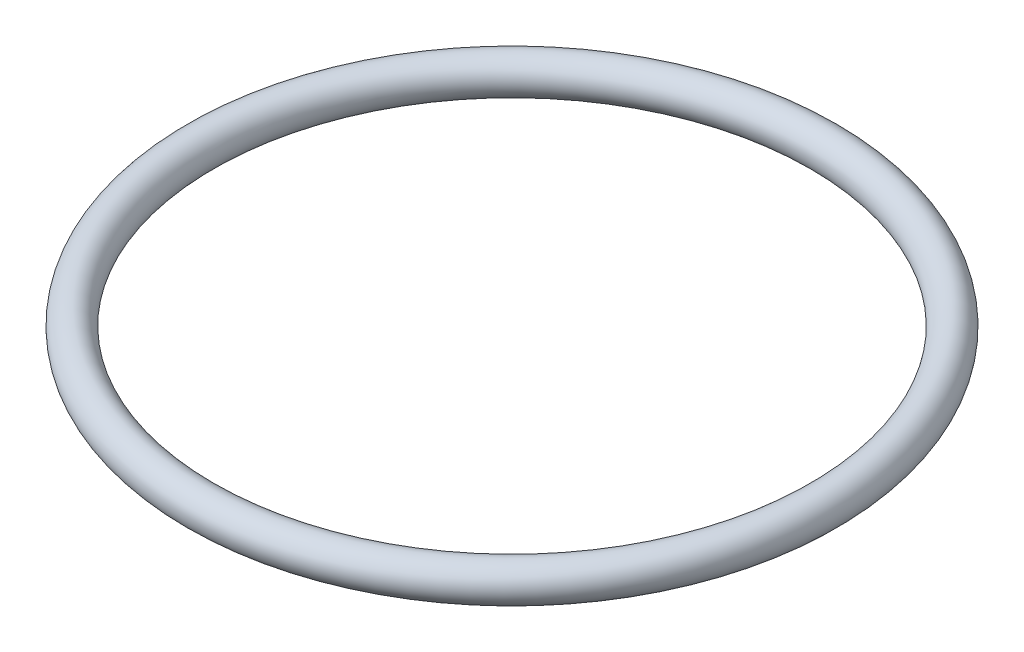
ISO-10303-21;
HEADER;
FILE_DESCRIPTION(('STEP AP214'),'2;1');
FILE_NAME('part.step','',(''),(''),'','','');
FILE_SCHEMA(('AUTOMOTIVE_DESIGN { 1 0 10303 214 1 1 1 1 }'));
ENDSEC;
DATA;
#1=APPLICATION_CONTEXT('core data for automotive mechanical design processes');
#2=APPLICATION_PROTOCOL_DEFINITION('international standard','automotive_design',2000,#1);
#3=PRODUCT_CONTEXT('',#1,'mechanical');
#4=PRODUCT('Part','Part','',(#3));
#5=PRODUCT_RELATED_PRODUCT_CATEGORY('part','',(#4));
#6=PRODUCT_DEFINITION_FORMATION('','',#4);
#7=PRODUCT_DEFINITION_CONTEXT('part definition',#1,'design');
#8=PRODUCT_DEFINITION('design','',#6,#7);
#9=PRODUCT_DEFINITION_SHAPE('','',#8);
#10=(LENGTH_UNIT() NAMED_UNIT(*) SI_UNIT(.MILLI.,.METRE.));
#11=(NAMED_UNIT(*) PLANE_ANGLE_UNIT() SI_UNIT($,.RADIAN.));
#12=(NAMED_UNIT(*) SI_UNIT($,.STERADIAN.) SOLID_ANGLE_UNIT());
#13=UNCERTAINTY_MEASURE_WITH_UNIT(LENGTH_MEASURE(1.E-05),#10,'distance_accuracy_value','');
#14=(GEOMETRIC_REPRESENTATION_CONTEXT(3) GLOBAL_UNCERTAINTY_ASSIGNED_CONTEXT((#13)) GLOBAL_UNIT_ASSIGNED_CONTEXT((#10,
#11,#12)) REPRESENTATION_CONTEXT('',''));
#15=CARTESIAN_POINT('',(0.,0.,0.));
#16=DIRECTION('',(0.,0.,1.));
#17=DIRECTION('',(1.,0.,0.));
#18=AXIS2_PLACEMENT_3D('',#15,#16,#17);
#19=CARTESIAN_POINT('',(0.,0.,0.));
#20=DIRECTION('',(0.,-1.,0.));
#21=DIRECTION('',(0.,0.,-1.));
#22=AXIS2_PLACEMENT_3D('',#19,#20,#21);
#23=TOROIDAL_SURFACE('',#22,21.25,1.25);
#24=CARTESIAN_POINT('',(0.,0.,-22.5));
#25=VERTEX_POINT('',#24);
#26=VERTEX_LOOP('',#25);
#27=FACE_BOUND('',#26,.T.);
#28=ADVANCED_FACE('F31',(#27),#23,.T.);
#29=CLOSED_SHELL('',(#28));
#30=MANIFOLD_SOLID_BREP('B2',#29);
#31=ADVANCED_BREP_SHAPE_REPRESENTATION('',(#18,#30),#14);
#32=SHAPE_DEFINITION_REPRESENTATION(#9,#31);
ENDSEC;
END-ISO-10303-21;
